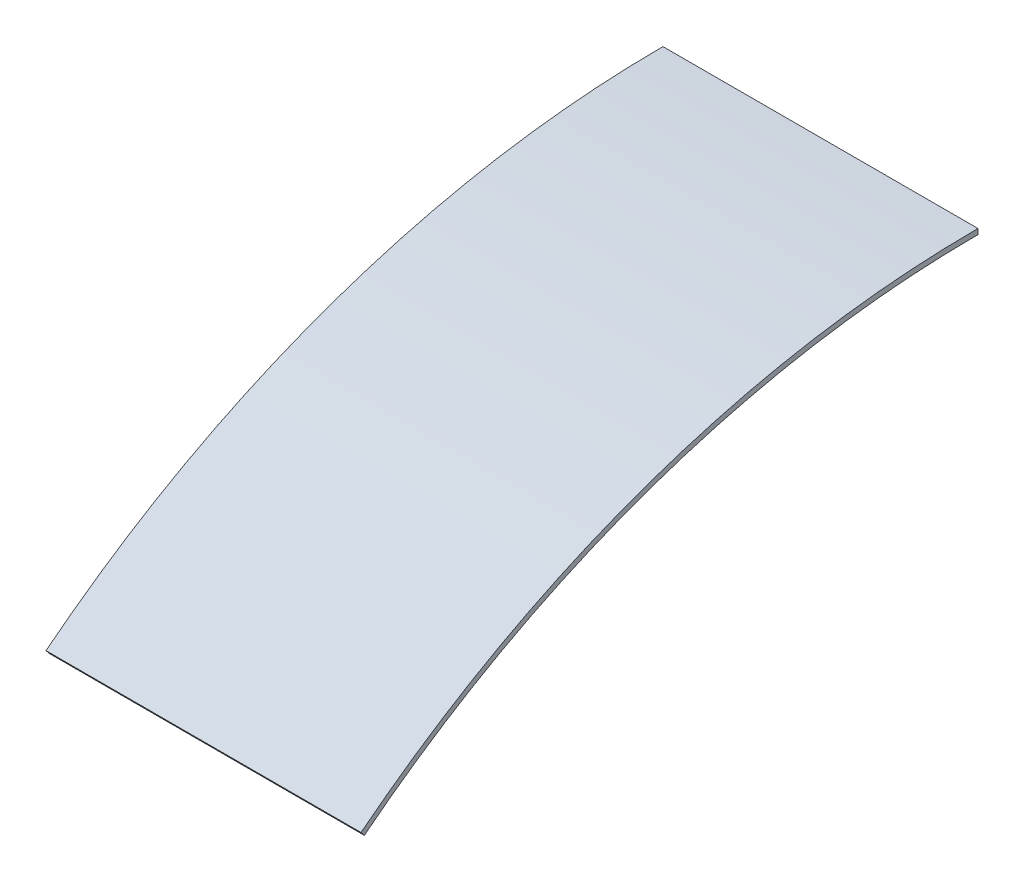
ISO-10303-21;
HEADER;
FILE_DESCRIPTION(('STEP AP214'),'2;1');
FILE_NAME('part.step','',(''),(''),'','','');
FILE_SCHEMA(('AUTOMOTIVE_DESIGN { 1 0 10303 214 1 1 1 1 }'));
ENDSEC;
DATA;
#1=APPLICATION_CONTEXT('core data for automotive mechanical design processes');
#2=APPLICATION_PROTOCOL_DEFINITION('international standard','automotive_design',2000,#1);
#3=PRODUCT_CONTEXT('',#1,'mechanical');
#4=PRODUCT('Part','Part','',(#3));
#5=PRODUCT_RELATED_PRODUCT_CATEGORY('part','',(#4));
#6=PRODUCT_DEFINITION_FORMATION('','',#4);
#7=PRODUCT_DEFINITION_CONTEXT('part definition',#1,'design');
#8=PRODUCT_DEFINITION('design','',#6,#7);
#9=PRODUCT_DEFINITION_SHAPE('','',#8);
#10=(LENGTH_UNIT() NAMED_UNIT(*) SI_UNIT(.MILLI.,.METRE.));
#11=(NAMED_UNIT(*) PLANE_ANGLE_UNIT() SI_UNIT($,.RADIAN.));
#12=(NAMED_UNIT(*) SI_UNIT($,.STERADIAN.) SOLID_ANGLE_UNIT());
#13=UNCERTAINTY_MEASURE_WITH_UNIT(LENGTH_MEASURE(1.E-05),#10,'distance_accuracy_value','');
#14=(GEOMETRIC_REPRESENTATION_CONTEXT(3) GLOBAL_UNCERTAINTY_ASSIGNED_CONTEXT((#13)) GLOBAL_UNIT_ASSIGNED_CONTEXT((#10,
#11,#12)) REPRESENTATION_CONTEXT('',''));
#15=CARTESIAN_POINT('',(0.,0.,0.));
#16=DIRECTION('',(0.,0.,1.));
#17=DIRECTION('',(1.,0.,0.));
#18=AXIS2_PLACEMENT_3D('',#15,#16,#17);
#19=CARTESIAN_POINT('',(177.8,0.,0.));
#20=DIRECTION('',(0.,0.,-1.));
#21=DIRECTION('',(-1.,0.,0.));
#22=AXIS2_PLACEMENT_3D('',#19,#20,#21);
#23=PLANE('',#22);
#24=DIRECTION('',(0.,-1.,0.));
#25=VECTOR('',#24,1.);
#26=CARTESIAN_POINT('',(0.,0.,0.));
#27=LINE('',#26,#25);
#28=CARTESIAN_POINT('',(0.,0.,0.));
#29=VERTEX_POINT('',#28);
#30=CARTESIAN_POINT('',(0.,-2.99720000000004,0.));
#31=VERTEX_POINT('',#30);
#32=EDGE_CURVE('E109',#29,#31,#27,.T.);
#33=ORIENTED_EDGE('',*,*,#32,.F.);
#34=DIRECTION('',(-1.,0.,0.));
#35=VECTOR('',#34,1.);
#36=CARTESIAN_POINT('',(177.8,0.,0.));
#37=LINE('',#36,#35);
#38=CARTESIAN_POINT('',(177.8,0.,0.));
#39=VERTEX_POINT('',#38);
#40=EDGE_CURVE('E11',#39,#29,#37,.T.);
#41=ORIENTED_EDGE('',*,*,#40,.F.);
#42=DIRECTION('',(0.,-1.,0.));
#43=VECTOR('',#42,1.);
#44=CARTESIAN_POINT('',(177.8,0.,0.));
#45=LINE('',#44,#43);
#46=CARTESIAN_POINT('',(177.8,-2.99720000000004,0.));
#47=VERTEX_POINT('',#46);
#48=EDGE_CURVE('E90',#39,#47,#45,.T.);
#49=ORIENTED_EDGE('',*,*,#48,.T.);
#50=DIRECTION('',(-1.,0.,0.));
#51=VECTOR('',#50,1.);
#52=CARTESIAN_POINT('',(177.8,-2.99720000000004,0.));
#53=LINE('',#52,#51);
#54=EDGE_CURVE('E58',#47,#31,#53,.T.);
#55=ORIENTED_EDGE('',*,*,#54,.T.);
#56=EDGE_LOOP('',(#33,#41,#49,#55));
#57=FACE_BOUND('',#56,.T.);
#58=ADVANCED_FACE('F41',(#57),#23,.T.);
#59=CARTESIAN_POINT('',(177.8,-561.15065189,0.));
#60=DIRECTION('',(-1.,0.,0.));
#61=DIRECTION('',(0.,0.,1.));
#62=AXIS2_PLACEMENT_3D('',#59,#60,#61);
#63=CYLINDRICAL_SURFACE('',#62,561.15065189);
#64=CARTESIAN_POINT('',(0.,-561.15065189,0.));
#65=DIRECTION('',(1.,0.,0.));
#66=DIRECTION('',(0.,0.,-1.));
#67=AXIS2_PLACEMENT_3D('',#64,#65,#66);
#68=CIRCLE('',#67,561.15065189);
#69=CARTESIAN_POINT('',(0.,-121.111381928414,348.217597212212));
#70=VERTEX_POINT('',#69);
#71=EDGE_CURVE('E97',#29,#70,#68,.T.);
#72=ORIENTED_EDGE('',*,*,#71,.T.);
#73=DIRECTION('',(-1.,0.,0.));
#74=VECTOR('',#73,1.);
#75=CARTESIAN_POINT('',(177.8,-121.111381928414,348.217597212212));
#76=LINE('',#75,#74);
#77=CARTESIAN_POINT('',(177.8,-121.111381928414,348.217597212212));
#78=VERTEX_POINT('',#77);
#79=EDGE_CURVE('E50',#78,#70,#76,.T.);
#80=ORIENTED_EDGE('',*,*,#79,.F.);
#81=CARTESIAN_POINT('',(177.8,-561.15065189,0.));
#82=DIRECTION('',(1.,0.,0.));
#83=DIRECTION('',(0.,0.,-1.));
#84=AXIS2_PLACEMENT_3D('',#81,#82,#83);
#85=CIRCLE('',#84,561.15065189);
#86=EDGE_CURVE('E84',#39,#78,#85,.T.);
#87=ORIENTED_EDGE('',*,*,#86,.F.);
#88=ORIENTED_EDGE('',*,*,#40,.T.);
#89=EDGE_LOOP('',(#72,#80,#87,#88));
#90=FACE_BOUND('',#89,.T.);
#91=ADVANCED_FACE('F95',(#90),#63,.T.);
#92=CARTESIAN_POINT('',(177.8,-216.083674856029,273.062887388527));
#93=DIRECTION('',(0.,-0.620542088010398,0.784173142238176));
#94=DIRECTION('',(0.,-0.784173142238176,-0.620542088010398));
#95=AXIS2_PLACEMENT_3D('',#92,#93,#94);
#96=PLANE('',#95);
#97=DIRECTION('',(0.,0.784173142238176,0.620542088010398));
#98=VECTOR('',#97,1.);
#99=CARTESIAN_POINT('',(0.,-216.083674856029,273.062887388527));
#100=LINE('',#99,#98);
#101=CARTESIAN_POINT('',(0.,-123.46170567033,346.357708466028));
#102=VERTEX_POINT('',#101);
#103=EDGE_CURVE('E114',#102,#70,#100,.T.);
#104=ORIENTED_EDGE('',*,*,#103,.F.);
#105=DIRECTION('',(-1.,0.,0.));
#106=VECTOR('',#105,1.);
#107=CARTESIAN_POINT('',(177.8,-123.46170567033,346.357708466028));
#108=LINE('',#107,#106);
#109=CARTESIAN_POINT('',(177.8,-123.46170567033,346.357708466028));
#110=VERTEX_POINT('',#109);
#111=EDGE_CURVE('E71',#110,#102,#108,.T.);
#112=ORIENTED_EDGE('',*,*,#111,.F.);
#113=DIRECTION('',(0.,0.784173142238176,0.620542088010398));
#114=VECTOR('',#113,1.);
#115=CARTESIAN_POINT('',(177.8,-216.083674856029,273.062887388527));
#116=LINE('',#115,#114);
#117=EDGE_CURVE('E89',#110,#78,#116,.T.);
#118=ORIENTED_EDGE('',*,*,#117,.T.);
#119=ORIENTED_EDGE('',*,*,#79,.T.);
#120=EDGE_LOOP('',(#104,#112,#118,#119));
#121=FACE_BOUND('',#120,.T.);
#122=ADVANCED_FACE('F101',(#121),#96,.T.);
#123=CARTESIAN_POINT('',(177.8,-561.15065189,0.));
#124=DIRECTION('',(-1.,0.,0.));
#125=DIRECTION('',(0.,0.,1.));
#126=AXIS2_PLACEMENT_3D('',#123,#124,#125);
#127=CYLINDRICAL_SURFACE('',#126,558.15345189);
#128=CARTESIAN_POINT('',(0.,-561.15065189,0.));
#129=DIRECTION('',(1.,0.,0.));
#130=DIRECTION('',(0.,0.,-1.));
#131=AXIS2_PLACEMENT_3D('',#128,#129,#130);
#132=CIRCLE('',#131,558.15345189);
#133=EDGE_CURVE('E117',#31,#102,#132,.T.);
#134=ORIENTED_EDGE('',*,*,#133,.F.);
#135=ORIENTED_EDGE('',*,*,#54,.F.);
#136=CARTESIAN_POINT('',(177.8,-561.15065189,0.));
#137=DIRECTION('',(1.,0.,0.));
#138=DIRECTION('',(0.,0.,-1.));
#139=AXIS2_PLACEMENT_3D('',#136,#137,#138);
#140=CIRCLE('',#139,558.15345189);
#141=EDGE_CURVE('E103',#47,#110,#140,.T.);
#142=ORIENTED_EDGE('',*,*,#141,.T.);
#143=ORIENTED_EDGE('',*,*,#111,.T.);
#144=EDGE_LOOP('',(#134,#135,#142,#143));
#145=FACE_BOUND('',#144,.T.);
#146=ADVANCED_FACE('F126',(#145),#127,.F.);
#147=CARTESIAN_POINT('',(177.8,0.,0.));
#148=DIRECTION('',(1.,0.,0.));
#149=DIRECTION('',(0.,0.,-1.));
#150=AXIS2_PLACEMENT_3D('',#147,#148,#149);
#151=PLANE('',#150);
#152=ORIENTED_EDGE('',*,*,#48,.F.);
#153=ORIENTED_EDGE('',*,*,#86,.T.);
#154=ORIENTED_EDGE('',*,*,#117,.F.);
#155=ORIENTED_EDGE('',*,*,#141,.F.);
#156=EDGE_LOOP('',(#152,#153,#154,#155));
#157=FACE_BOUND('',#156,.T.);
#158=ADVANCED_FACE('F86',(#157),#151,.T.);
#159=CARTESIAN_POINT('',(0.,0.,0.));
#160=DIRECTION('',(1.,0.,0.));
#161=DIRECTION('',(0.,0.,-1.));
#162=AXIS2_PLACEMENT_3D('',#159,#160,#161);
#163=PLANE('',#162);
#164=ORIENTED_EDGE('',*,*,#32,.T.);
#165=ORIENTED_EDGE('',*,*,#133,.T.);
#166=ORIENTED_EDGE('',*,*,#103,.T.);
#167=ORIENTED_EDGE('',*,*,#71,.F.);
#168=EDGE_LOOP('',(#164,#165,#166,#167));
#169=FACE_BOUND('',#168,.T.);
#170=ADVANCED_FACE('F133',(#169),#163,.F.);
#171=CLOSED_SHELL('',(#58,#91,#122,#146,#158,#170));
#172=MANIFOLD_SOLID_BREP('B2',#171);
#173=ADVANCED_BREP_SHAPE_REPRESENTATION('',(#18,#172),#14);
#174=SHAPE_DEFINITION_REPRESENTATION(#9,#173);
ENDSEC;
END-ISO-10303-21;
